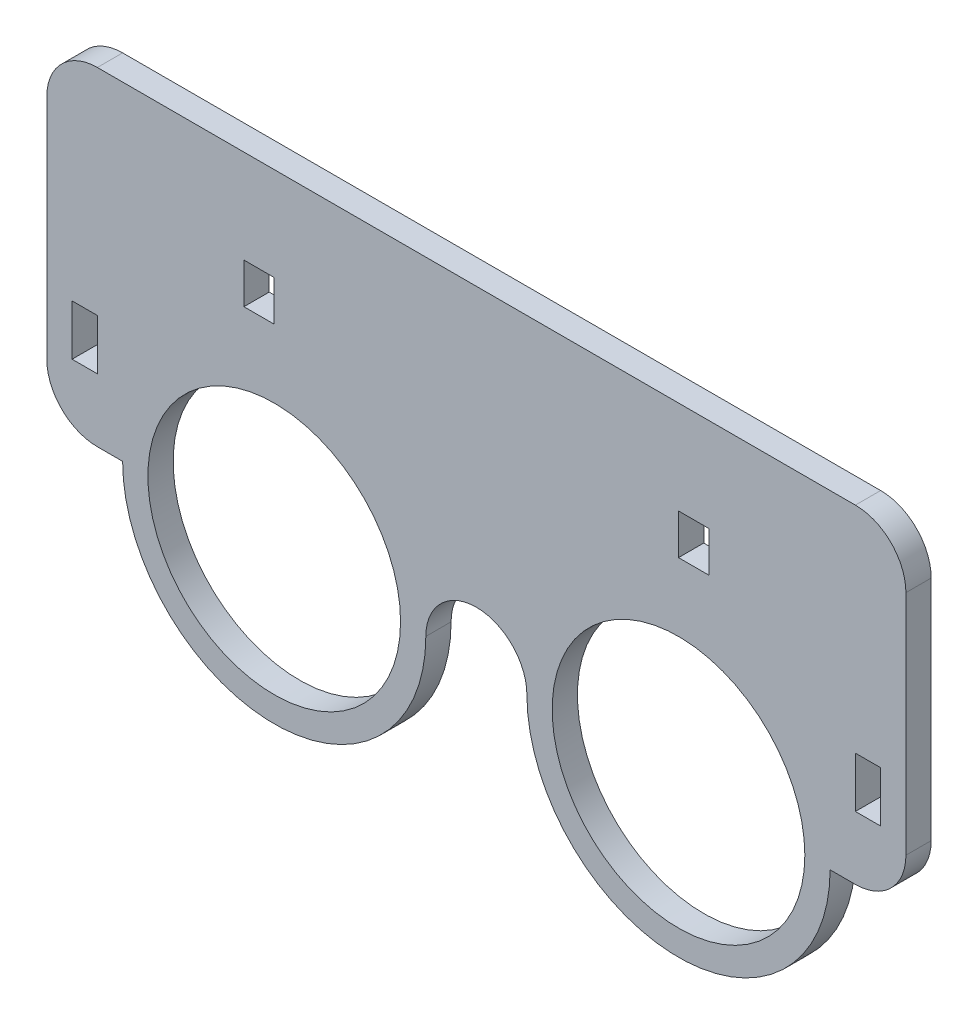
ISO-10303-21;
HEADER;
FILE_DESCRIPTION(('STEP AP214'),'2;1');
FILE_NAME('part.step','',(''),(''),'','','');
FILE_SCHEMA(('AUTOMOTIVE_DESIGN { 1 0 10303 214 1 1 1 1 }'));
ENDSEC;
DATA;
#1=APPLICATION_CONTEXT('core data for automotive mechanical design processes');
#2=APPLICATION_PROTOCOL_DEFINITION('international standard','automotive_design',2000,#1);
#3=PRODUCT_CONTEXT('',#1,'mechanical');
#4=PRODUCT('Part','Part','',(#3));
#5=PRODUCT_RELATED_PRODUCT_CATEGORY('part','',(#4));
#6=PRODUCT_DEFINITION_FORMATION('','',#4);
#7=PRODUCT_DEFINITION_CONTEXT('part definition',#1,'design');
#8=PRODUCT_DEFINITION('design','',#6,#7);
#9=PRODUCT_DEFINITION_SHAPE('','',#8);
#10=(LENGTH_UNIT() NAMED_UNIT(*) SI_UNIT(.MILLI.,.METRE.));
#11=(NAMED_UNIT(*) PLANE_ANGLE_UNIT() SI_UNIT($,.RADIAN.));
#12=(NAMED_UNIT(*) SI_UNIT($,.STERADIAN.) SOLID_ANGLE_UNIT());
#13=UNCERTAINTY_MEASURE_WITH_UNIT(LENGTH_MEASURE(1.E-05),#10,'distance_accuracy_value','');
#14=(GEOMETRIC_REPRESENTATION_CONTEXT(3) GLOBAL_UNCERTAINTY_ASSIGNED_CONTEXT((#13)) GLOBAL_UNIT_ASSIGNED_CONTEXT((#10,
#11,#12)) REPRESENTATION_CONTEXT('',''));
#15=CARTESIAN_POINT('',(0.,0.,0.));
#16=DIRECTION('',(0.,0.,1.));
#17=DIRECTION('',(1.,0.,0.));
#18=AXIS2_PLACEMENT_3D('',#15,#16,#17);
#19=CARTESIAN_POINT('',(0.,0.,5.));
#20=DIRECTION('',(0.,0.,1.));
#21=DIRECTION('',(1.,0.,0.));
#22=AXIS2_PLACEMENT_3D('',#19,#20,#21);
#23=PLANE('',#22);
#24=CARTESIAN_POINT('',(-40.,0.,5.));
#25=DIRECTION('',(0.,0.,1.));
#26=DIRECTION('',(1.,0.,0.));
#27=AXIS2_PLACEMENT_3D('',#24,#25,#26);
#28=CIRCLE('',#27,25.);
#29=CARTESIAN_POINT('',(-15.,0.,5.));
#30=VERTEX_POINT('',#29);
#31=EDGE_CURVE('E326',#30,#30,#28,.T.);
#32=ORIENTED_EDGE('',*,*,#31,.F.);
#33=EDGE_LOOP('',(#32));
#34=FACE_BOUND('',#33,.T.);
#35=CARTESIAN_POINT('',(0.,0.,5.));
#36=DIRECTION('',(0.,0.,-1.));
#37=DIRECTION('',(1.,0.,0.));
#38=AXIS2_PLACEMENT_3D('',#35,#36,#37);
#39=CIRCLE('',#38,10.);
#40=CARTESIAN_POINT('',(-9.99999999999999,0.,5.));
#41=VERTEX_POINT('',#40);
#42=CARTESIAN_POINT('',(9.99999999999999,0.,5.));
#43=VERTEX_POINT('',#42);
#44=EDGE_CURVE('E363',#41,#43,#39,.T.);
#45=ORIENTED_EDGE('',*,*,#44,.T.);
#46=CARTESIAN_POINT('',(40.,0.,5.));
#47=DIRECTION('',(0.,0.,1.));
#48=DIRECTION('',(1.,0.,0.));
#49=AXIS2_PLACEMENT_3D('',#46,#47,#48);
#50=CIRCLE('',#49,30.);
#51=CARTESIAN_POINT('',(70.,0.,5.));
#52=VERTEX_POINT('',#51);
#53=EDGE_CURVE('E366',#43,#52,#50,.T.);
#54=ORIENTED_EDGE('',*,*,#53,.T.);
#55=DIRECTION('',(1.,0.,0.));
#56=VECTOR('',#55,1.);
#57=CARTESIAN_POINT('',(74.9999999999999,0.,5.));
#58=LINE('',#57,#56);
#59=CARTESIAN_POINT('',(74.9999999999999,0.,5.));
#60=VERTEX_POINT('',#59);
#61=EDGE_CURVE('E369',#52,#60,#58,.T.);
#62=ORIENTED_EDGE('',*,*,#61,.T.);
#63=CARTESIAN_POINT('',(75.,10.,5.));
#64=DIRECTION('',(0.,0.,1.));
#65=DIRECTION('',(-1.,0.,0.));
#66=AXIS2_PLACEMENT_3D('',#63,#64,#65);
#67=CIRCLE('',#66,10.);
#68=CARTESIAN_POINT('',(85.,10.0000000000001,5.));
#69=VERTEX_POINT('',#68);
#70=EDGE_CURVE('E371',#60,#69,#67,.T.);
#71=ORIENTED_EDGE('',*,*,#70,.T.);
#72=DIRECTION('',(0.,1.,0.));
#73=VECTOR('',#72,1.);
#74=CARTESIAN_POINT('',(85.,54.9999999999999,5.));
#75=LINE('',#74,#73);
#76=CARTESIAN_POINT('',(85.,54.9999999999999,5.));
#77=VERTEX_POINT('',#76);
#78=EDGE_CURVE('E373',#69,#77,#75,.T.);
#79=ORIENTED_EDGE('',*,*,#78,.T.);
#80=CARTESIAN_POINT('',(75.,55.,5.));
#81=DIRECTION('',(0.,0.,1.));
#82=DIRECTION('',(-1.,0.,0.));
#83=AXIS2_PLACEMENT_3D('',#80,#81,#82);
#84=CIRCLE('',#83,10.);
#85=CARTESIAN_POINT('',(74.9999999999999,65.,5.));
#86=VERTEX_POINT('',#85);
#87=EDGE_CURVE('E375',#77,#86,#84,.T.);
#88=ORIENTED_EDGE('',*,*,#87,.T.);
#89=DIRECTION('',(-1.,0.,0.));
#90=VECTOR('',#89,1.);
#91=CARTESIAN_POINT('',(-74.9999999999999,65.,5.));
#92=LINE('',#91,#90);
#93=CARTESIAN_POINT('',(-74.9999999999999,65.,5.));
#94=VERTEX_POINT('',#93);
#95=EDGE_CURVE('E377',#86,#94,#92,.T.);
#96=ORIENTED_EDGE('',*,*,#95,.T.);
#97=CARTESIAN_POINT('',(-75.,55.,5.));
#98=DIRECTION('',(0.,0.,1.));
#99=DIRECTION('',(-1.,0.,0.));
#100=AXIS2_PLACEMENT_3D('',#97,#98,#99);
#101=CIRCLE('',#100,9.99999999999999);
#102=CARTESIAN_POINT('',(-85.,54.9999999999999,5.));
#103=VERTEX_POINT('',#102);
#104=EDGE_CURVE('E379',#94,#103,#101,.T.);
#105=ORIENTED_EDGE('',*,*,#104,.T.);
#106=DIRECTION('',(0.,-1.,0.));
#107=VECTOR('',#106,1.);
#108=CARTESIAN_POINT('',(-85.,10.0000000000001,5.));
#109=LINE('',#108,#107);
#110=CARTESIAN_POINT('',(-85.,10.0000000000001,5.));
#111=VERTEX_POINT('',#110);
#112=EDGE_CURVE('E381',#103,#111,#109,.T.);
#113=ORIENTED_EDGE('',*,*,#112,.T.);
#114=CARTESIAN_POINT('',(-75.,10.,5.));
#115=DIRECTION('',(0.,0.,1.));
#116=DIRECTION('',(1.,0.,0.));
#117=AXIS2_PLACEMENT_3D('',#114,#115,#116);
#118=CIRCLE('',#117,10.);
#119=CARTESIAN_POINT('',(-74.9999999999999,0.,5.));
#120=VERTEX_POINT('',#119);
#121=EDGE_CURVE('E383',#111,#120,#118,.T.);
#122=ORIENTED_EDGE('',*,*,#121,.T.);
#123=DIRECTION('',(1.,0.,0.));
#124=VECTOR('',#123,1.);
#125=CARTESIAN_POINT('',(-70.,0.,5.));
#126=LINE('',#125,#124);
#127=CARTESIAN_POINT('',(-70.,0.,5.));
#128=VERTEX_POINT('',#127);
#129=EDGE_CURVE('E385',#120,#128,#126,.T.);
#130=ORIENTED_EDGE('',*,*,#129,.T.);
#131=CARTESIAN_POINT('',(-40.,0.,5.));
#132=DIRECTION('',(0.,0.,1.));
#133=DIRECTION('',(1.,0.,0.));
#134=AXIS2_PLACEMENT_3D('',#131,#132,#133);
#135=CIRCLE('',#134,30.);
#136=EDGE_CURVE('E387',#128,#41,#135,.T.);
#137=ORIENTED_EDGE('',*,*,#136,.T.);
#138=EDGE_LOOP('',(#45,#54,#62,#71,#79,#88,#96,#105,#113,#122,#130,#137));
#139=FACE_BOUND('',#138,.T.);
#140=DIRECTION('',(1.,0.,0.));
#141=VECTOR('',#140,1.);
#142=CARTESIAN_POINT('',(-46.,38.5,5.));
#143=LINE('',#142,#141);
#144=CARTESIAN_POINT('',(-46.,38.5,5.));
#145=VERTEX_POINT('',#144);
#146=CARTESIAN_POINT('',(-40.,38.5,5.));
#147=VERTEX_POINT('',#146);
#148=EDGE_CURVE('E334',#145,#147,#143,.T.);
#149=ORIENTED_EDGE('',*,*,#148,.F.);
#150=DIRECTION('',(0.,-1.,0.));
#151=VECTOR('',#150,1.);
#152=CARTESIAN_POINT('',(-46.,38.5,5.));
#153=LINE('',#152,#151);
#154=CARTESIAN_POINT('',(-46.,46.5,5.));
#155=VERTEX_POINT('',#154);
#156=EDGE_CURVE('E332',#155,#145,#153,.T.);
#157=ORIENTED_EDGE('',*,*,#156,.F.);
#158=DIRECTION('',(-1.,0.,0.));
#159=VECTOR('',#158,1.);
#160=CARTESIAN_POINT('',(-46.,46.5,5.));
#161=LINE('',#160,#159);
#162=CARTESIAN_POINT('',(-40.,46.5,5.));
#163=VERTEX_POINT('',#162);
#164=EDGE_CURVE('E340',#163,#155,#161,.T.);
#165=ORIENTED_EDGE('',*,*,#164,.F.);
#166=DIRECTION('',(0.,1.,0.));
#167=VECTOR('',#166,1.);
#168=CARTESIAN_POINT('',(-40.,38.5,5.));
#169=LINE('',#168,#167);
#170=EDGE_CURVE('E337',#147,#163,#169,.T.);
#171=ORIENTED_EDGE('',*,*,#170,.F.);
#172=EDGE_LOOP('',(#149,#157,#165,#171));
#173=FACE_BOUND('',#172,.T.);
#174=CARTESIAN_POINT('',(40.,0.,5.));
#175=DIRECTION('',(0.,0.,1.));
#176=DIRECTION('',(1.,0.,0.));
#177=AXIS2_PLACEMENT_3D('',#174,#175,#176);
#178=CIRCLE('',#177,25.);
#179=CARTESIAN_POINT('',(65.,0.,5.));
#180=VERTEX_POINT('',#179);
#181=EDGE_CURVE('E320',#180,#180,#178,.T.);
#182=ORIENTED_EDGE('',*,*,#181,.F.);
#183=EDGE_LOOP('',(#182));
#184=FACE_BOUND('',#183,.T.);
#185=DIRECTION('',(-1.,0.,0.));
#186=VECTOR('',#185,1.);
#187=CARTESIAN_POINT('',(46.,46.5,5.));
#188=LINE('',#187,#186);
#189=CARTESIAN_POINT('',(46.,46.5,5.));
#190=VERTEX_POINT('',#189);
#191=CARTESIAN_POINT('',(40.,46.5,5.));
#192=VERTEX_POINT('',#191);
#193=EDGE_CURVE('E291',#190,#192,#188,.T.);
#194=ORIENTED_EDGE('',*,*,#193,.F.);
#195=DIRECTION('',(0.,1.,0.));
#196=VECTOR('',#195,1.);
#197=CARTESIAN_POINT('',(46.,38.5,5.));
#198=LINE('',#197,#196);
#199=CARTESIAN_POINT('',(46.,38.5,5.));
#200=VERTEX_POINT('',#199);
#201=EDGE_CURVE('E289',#200,#190,#198,.T.);
#202=ORIENTED_EDGE('',*,*,#201,.F.);
#203=DIRECTION('',(1.,0.,0.));
#204=VECTOR('',#203,1.);
#205=CARTESIAN_POINT('',(46.,38.5,5.));
#206=LINE('',#205,#204);
#207=CARTESIAN_POINT('',(40.,38.5,5.));
#208=VERTEX_POINT('',#207);
#209=EDGE_CURVE('E297',#208,#200,#206,.T.);
#210=ORIENTED_EDGE('',*,*,#209,.F.);
#211=DIRECTION('',(0.,-1.,0.));
#212=VECTOR('',#211,1.);
#213=CARTESIAN_POINT('',(40.,38.5,5.));
#214=LINE('',#213,#212);
#215=EDGE_CURVE('E294',#192,#208,#214,.T.);
#216=ORIENTED_EDGE('',*,*,#215,.F.);
#217=EDGE_LOOP('',(#194,#202,#210,#216));
#218=FACE_BOUND('',#217,.T.);
#219=DIRECTION('',(1.,0.,0.));
#220=VECTOR('',#219,1.);
#221=CARTESIAN_POINT('',(-80.,12.5,5.));
#222=LINE('',#221,#220);
#223=CARTESIAN_POINT('',(-80.,12.5,5.));
#224=VERTEX_POINT('',#223);
#225=CARTESIAN_POINT('',(-75.,12.5,5.));
#226=VERTEX_POINT('',#225);
#227=EDGE_CURVE('E260',#224,#226,#222,.T.);
#228=ORIENTED_EDGE('',*,*,#227,.F.);
#229=DIRECTION('',(0.,-1.,0.));
#230=VECTOR('',#229,1.);
#231=CARTESIAN_POINT('',(-80.,22.5,5.));
#232=LINE('',#231,#230);
#233=CARTESIAN_POINT('',(-80.,22.5,5.));
#234=VERTEX_POINT('',#233);
#235=EDGE_CURVE('E258',#234,#224,#232,.T.);
#236=ORIENTED_EDGE('',*,*,#235,.F.);
#237=DIRECTION('',(-1.,0.,0.));
#238=VECTOR('',#237,1.);
#239=CARTESIAN_POINT('',(-80.,22.5,5.));
#240=LINE('',#239,#238);
#241=CARTESIAN_POINT('',(-75.,22.5,5.));
#242=VERTEX_POINT('',#241);
#243=EDGE_CURVE('E266',#242,#234,#240,.T.);
#244=ORIENTED_EDGE('',*,*,#243,.F.);
#245=DIRECTION('',(0.,1.,0.));
#246=VECTOR('',#245,1.);
#247=CARTESIAN_POINT('',(-75.,22.5,5.));
#248=LINE('',#247,#246);
#249=EDGE_CURVE('E263',#226,#242,#248,.T.);
#250=ORIENTED_EDGE('',*,*,#249,.F.);
#251=EDGE_LOOP('',(#228,#236,#244,#250));
#252=FACE_BOUND('',#251,.T.);
#253=DIRECTION('',(1.,0.,0.));
#254=VECTOR('',#253,1.);
#255=CARTESIAN_POINT('',(75.,12.5,5.));
#256=LINE('',#255,#254);
#257=CARTESIAN_POINT('',(75.,12.5,5.));
#258=VERTEX_POINT('',#257);
#259=CARTESIAN_POINT('',(80.,12.5,5.));
#260=VERTEX_POINT('',#259);
#261=EDGE_CURVE('E230',#258,#260,#256,.T.);
#262=ORIENTED_EDGE('',*,*,#261,.F.);
#263=DIRECTION('',(0.,-1.,0.));
#264=VECTOR('',#263,1.);
#265=CARTESIAN_POINT('',(75.,12.5,5.));
#266=LINE('',#265,#264);
#267=CARTESIAN_POINT('',(75.,22.5,5.));
#268=VERTEX_POINT('',#267);
#269=EDGE_CURVE('E222',#268,#258,#266,.T.);
#270=ORIENTED_EDGE('',*,*,#269,.F.);
#271=DIRECTION('',(-1.,0.,0.));
#272=VECTOR('',#271,1.);
#273=CARTESIAN_POINT('',(75.,22.5,5.));
#274=LINE('',#273,#272);
#275=CARTESIAN_POINT('',(80.,22.5,5.));
#276=VERTEX_POINT('',#275);
#277=EDGE_CURVE('E244',#276,#268,#274,.T.);
#278=ORIENTED_EDGE('',*,*,#277,.F.);
#279=DIRECTION('',(0.,1.,0.));
#280=VECTOR('',#279,1.);
#281=CARTESIAN_POINT('',(80.,12.5,5.));
#282=LINE('',#281,#280);
#283=EDGE_CURVE('E242',#260,#276,#282,.T.);
#284=ORIENTED_EDGE('',*,*,#283,.F.);
#285=EDGE_LOOP('',(#262,#270,#278,#284));
#286=FACE_BOUND('',#285,.T.);
#287=ADVANCED_FACE('F37',(#34,#139,#173,#184,#218,#252,#286),#23,.T.);
#288=CARTESIAN_POINT('',(0.,0.,0.));
#289=DIRECTION('',(0.,0.,1.));
#290=DIRECTION('',(1.,0.,0.));
#291=AXIS2_PLACEMENT_3D('',#288,#289,#290);
#292=PLANE('',#291);
#293=DIRECTION('',(0.,-1.,0.));
#294=VECTOR('',#293,1.);
#295=CARTESIAN_POINT('',(-80.,22.5,0.));
#296=LINE('',#295,#294);
#297=CARTESIAN_POINT('',(-80.,22.5,0.));
#298=VERTEX_POINT('',#297);
#299=CARTESIAN_POINT('',(-80.,12.5,0.));
#300=VERTEX_POINT('',#299);
#301=EDGE_CURVE('E238',#298,#300,#296,.T.);
#302=ORIENTED_EDGE('',*,*,#301,.T.);
#303=DIRECTION('',(1.,0.,0.));
#304=VECTOR('',#303,1.);
#305=CARTESIAN_POINT('',(-80.,12.5,0.));
#306=LINE('',#305,#304);
#307=CARTESIAN_POINT('',(-75.,12.5,0.));
#308=VERTEX_POINT('',#307);
#309=EDGE_CURVE('E271',#300,#308,#306,.T.);
#310=ORIENTED_EDGE('',*,*,#309,.T.);
#311=DIRECTION('',(0.,1.,0.));
#312=VECTOR('',#311,1.);
#313=CARTESIAN_POINT('',(-75.,22.5,0.));
#314=LINE('',#313,#312);
#315=CARTESIAN_POINT('',(-75.,22.5,0.));
#316=VERTEX_POINT('',#315);
#317=EDGE_CURVE('E274',#308,#316,#314,.T.);
#318=ORIENTED_EDGE('',*,*,#317,.T.);
#319=DIRECTION('',(-1.,0.,0.));
#320=VECTOR('',#319,1.);
#321=CARTESIAN_POINT('',(-80.,22.5,0.));
#322=LINE('',#321,#320);
#323=EDGE_CURVE('E261',#316,#298,#322,.T.);
#324=ORIENTED_EDGE('',*,*,#323,.T.);
#325=EDGE_LOOP('',(#302,#310,#318,#324));
#326=FACE_BOUND('',#325,.T.);
#327=CARTESIAN_POINT('',(40.,0.,0.));
#328=DIRECTION('',(0.,0.,1.));
#329=DIRECTION('',(1.,0.,0.));
#330=AXIS2_PLACEMENT_3D('',#327,#328,#329);
#331=CIRCLE('',#330,25.);
#332=CARTESIAN_POINT('',(65.,0.,0.));
#333=VERTEX_POINT('',#332);
#334=EDGE_CURVE('E319',#333,#333,#331,.T.);
#335=ORIENTED_EDGE('',*,*,#334,.T.);
#336=EDGE_LOOP('',(#335));
#337=FACE_BOUND('',#336,.T.);
#338=CARTESIAN_POINT('',(-40.,0.,0.));
#339=DIRECTION('',(0.,0.,1.));
#340=DIRECTION('',(1.,0.,0.));
#341=AXIS2_PLACEMENT_3D('',#338,#339,#340);
#342=CIRCLE('',#341,25.);
#343=CARTESIAN_POINT('',(-15.,0.,0.));
#344=VERTEX_POINT('',#343);
#345=EDGE_CURVE('E323',#344,#344,#342,.T.);
#346=ORIENTED_EDGE('',*,*,#345,.T.);
#347=EDGE_LOOP('',(#346));
#348=FACE_BOUND('',#347,.T.);
#349=DIRECTION('',(0.,-1.,0.));
#350=VECTOR('',#349,1.);
#351=CARTESIAN_POINT('',(-46.,38.5,0.));
#352=LINE('',#351,#350);
#353=CARTESIAN_POINT('',(-46.,46.5,0.));
#354=VERTEX_POINT('',#353);
#355=CARTESIAN_POINT('',(-46.,38.5,0.));
#356=VERTEX_POINT('',#355);
#357=EDGE_CURVE('E329',#354,#356,#352,.T.);
#358=ORIENTED_EDGE('',*,*,#357,.T.);
#359=DIRECTION('',(1.,0.,0.));
#360=VECTOR('',#359,1.);
#361=CARTESIAN_POINT('',(-46.,38.5,0.));
#362=LINE('',#361,#360);
#363=CARTESIAN_POINT('',(-40.,38.5,0.));
#364=VERTEX_POINT('',#363);
#365=EDGE_CURVE('E345',#356,#364,#362,.T.);
#366=ORIENTED_EDGE('',*,*,#365,.T.);
#367=DIRECTION('',(0.,1.,0.));
#368=VECTOR('',#367,1.);
#369=CARTESIAN_POINT('',(-40.,38.5,0.));
#370=LINE('',#369,#368);
#371=CARTESIAN_POINT('',(-40.,46.5,0.));
#372=VERTEX_POINT('',#371);
#373=EDGE_CURVE('E348',#364,#372,#370,.T.);
#374=ORIENTED_EDGE('',*,*,#373,.T.);
#375=DIRECTION('',(-1.,0.,0.));
#376=VECTOR('',#375,1.);
#377=CARTESIAN_POINT('',(-46.,46.5,0.));
#378=LINE('',#377,#376);
#379=EDGE_CURVE('E335',#372,#354,#378,.T.);
#380=ORIENTED_EDGE('',*,*,#379,.T.);
#381=EDGE_LOOP('',(#358,#366,#374,#380));
#382=FACE_BOUND('',#381,.T.);
#383=CARTESIAN_POINT('',(0.,0.,0.));
#384=DIRECTION('',(0.,0.,-1.));
#385=DIRECTION('',(1.,0.,0.));
#386=AXIS2_PLACEMENT_3D('',#383,#384,#385);
#387=CIRCLE('',#386,10.);
#388=CARTESIAN_POINT('',(-9.99999999999999,0.,0.));
#389=VERTEX_POINT('',#388);
#390=CARTESIAN_POINT('',(9.99999999999999,0.,0.));
#391=VERTEX_POINT('',#390);
#392=EDGE_CURVE('E362',#389,#391,#387,.T.);
#393=ORIENTED_EDGE('',*,*,#392,.F.);
#394=CARTESIAN_POINT('',(-40.,0.,0.));
#395=DIRECTION('',(0.,0.,1.));
#396=DIRECTION('',(1.,0.,0.));
#397=AXIS2_PLACEMENT_3D('',#394,#395,#396);
#398=CIRCLE('',#397,30.);
#399=CARTESIAN_POINT('',(-70.,0.,0.));
#400=VERTEX_POINT('',#399);
#401=EDGE_CURVE('E367',#400,#389,#398,.T.);
#402=ORIENTED_EDGE('',*,*,#401,.F.);
#403=DIRECTION('',(1.,0.,0.));
#404=VECTOR('',#403,1.);
#405=CARTESIAN_POINT('',(-70.,0.,0.));
#406=LINE('',#405,#404);
#407=CARTESIAN_POINT('',(-74.9999999999999,0.,0.));
#408=VERTEX_POINT('',#407);
#409=EDGE_CURVE('E410',#408,#400,#406,.T.);
#410=ORIENTED_EDGE('',*,*,#409,.F.);
#411=CARTESIAN_POINT('',(-75.,10.,0.));
#412=DIRECTION('',(0.,0.,1.));
#413=DIRECTION('',(1.,0.,0.));
#414=AXIS2_PLACEMENT_3D('',#411,#412,#413);
#415=CIRCLE('',#414,10.);
#416=CARTESIAN_POINT('',(-85.,10.0000000000001,0.));
#417=VERTEX_POINT('',#416);
#418=EDGE_CURVE('E408',#417,#408,#415,.T.);
#419=ORIENTED_EDGE('',*,*,#418,.F.);
#420=DIRECTION('',(0.,-1.,0.));
#421=VECTOR('',#420,1.);
#422=CARTESIAN_POINT('',(-85.,10.0000000000001,0.));
#423=LINE('',#422,#421);
#424=CARTESIAN_POINT('',(-85.,54.9999999999999,0.));
#425=VERTEX_POINT('',#424);
#426=EDGE_CURVE('E406',#425,#417,#423,.T.);
#427=ORIENTED_EDGE('',*,*,#426,.F.);
#428=CARTESIAN_POINT('',(-75.,55.,0.));
#429=DIRECTION('',(0.,0.,1.));
#430=DIRECTION('',(-1.,0.,0.));
#431=AXIS2_PLACEMENT_3D('',#428,#429,#430);
#432=CIRCLE('',#431,9.99999999999999);
#433=CARTESIAN_POINT('',(-74.9999999999999,65.,0.));
#434=VERTEX_POINT('',#433);
#435=EDGE_CURVE('E404',#434,#425,#432,.T.);
#436=ORIENTED_EDGE('',*,*,#435,.F.);
#437=DIRECTION('',(-1.,0.,0.));
#438=VECTOR('',#437,1.);
#439=CARTESIAN_POINT('',(-74.9999999999999,65.,0.));
#440=LINE('',#439,#438);
#441=CARTESIAN_POINT('',(74.9999999999999,65.,0.));
#442=VERTEX_POINT('',#441);
#443=EDGE_CURVE('E402',#442,#434,#440,.T.);
#444=ORIENTED_EDGE('',*,*,#443,.F.);
#445=CARTESIAN_POINT('',(75.,55.,0.));
#446=DIRECTION('',(0.,0.,1.));
#447=DIRECTION('',(-1.,0.,0.));
#448=AXIS2_PLACEMENT_3D('',#445,#446,#447);
#449=CIRCLE('',#448,10.);
#450=CARTESIAN_POINT('',(85.,54.9999999999999,0.));
#451=VERTEX_POINT('',#450);
#452=EDGE_CURVE('E400',#451,#442,#449,.T.);
#453=ORIENTED_EDGE('',*,*,#452,.F.);
#454=DIRECTION('',(0.,1.,0.));
#455=VECTOR('',#454,1.);
#456=CARTESIAN_POINT('',(85.,54.9999999999999,0.));
#457=LINE('',#456,#455);
#458=CARTESIAN_POINT('',(85.,10.0000000000001,0.));
#459=VERTEX_POINT('',#458);
#460=EDGE_CURVE('E398',#459,#451,#457,.T.);
#461=ORIENTED_EDGE('',*,*,#460,.F.);
#462=CARTESIAN_POINT('',(75.,10.,0.));
#463=DIRECTION('',(0.,0.,1.));
#464=DIRECTION('',(-1.,0.,0.));
#465=AXIS2_PLACEMENT_3D('',#462,#463,#464);
#466=CIRCLE('',#465,10.);
#467=CARTESIAN_POINT('',(74.9999999999999,0.,0.));
#468=VERTEX_POINT('',#467);
#469=EDGE_CURVE('E396',#468,#459,#466,.T.);
#470=ORIENTED_EDGE('',*,*,#469,.F.);
#471=DIRECTION('',(1.,0.,0.));
#472=VECTOR('',#471,1.);
#473=CARTESIAN_POINT('',(74.9999999999999,0.,0.));
#474=LINE('',#473,#472);
#475=CARTESIAN_POINT('',(70.,0.,0.));
#476=VERTEX_POINT('',#475);
#477=EDGE_CURVE('E394',#476,#468,#474,.T.);
#478=ORIENTED_EDGE('',*,*,#477,.F.);
#479=CARTESIAN_POINT('',(40.,0.,0.));
#480=DIRECTION('',(0.,0.,1.));
#481=DIRECTION('',(1.,0.,0.));
#482=AXIS2_PLACEMENT_3D('',#479,#480,#481);
#483=CIRCLE('',#482,30.);
#484=EDGE_CURVE('E392',#391,#476,#483,.T.);
#485=ORIENTED_EDGE('',*,*,#484,.F.);
#486=EDGE_LOOP('',(#393,#402,#410,#419,#427,#436,#444,#453,#461,#470,#478,#485));
#487=FACE_BOUND('',#486,.T.);
#488=DIRECTION('',(0.,1.,0.));
#489=VECTOR('',#488,1.);
#490=CARTESIAN_POINT('',(46.,38.5,0.));
#491=LINE('',#490,#489);
#492=CARTESIAN_POINT('',(46.,38.5,0.));
#493=VERTEX_POINT('',#492);
#494=CARTESIAN_POINT('',(46.,46.5,0.));
#495=VERTEX_POINT('',#494);
#496=EDGE_CURVE('E288',#493,#495,#491,.T.);
#497=ORIENTED_EDGE('',*,*,#496,.T.);
#498=DIRECTION('',(-1.,0.,0.));
#499=VECTOR('',#498,1.);
#500=CARTESIAN_POINT('',(46.,46.5,0.));
#501=LINE('',#500,#499);
#502=CARTESIAN_POINT('',(40.,46.5,0.));
#503=VERTEX_POINT('',#502);
#504=EDGE_CURVE('E302',#495,#503,#501,.T.);
#505=ORIENTED_EDGE('',*,*,#504,.T.);
#506=DIRECTION('',(0.,-1.,0.));
#507=VECTOR('',#506,1.);
#508=CARTESIAN_POINT('',(40.,38.5,0.));
#509=LINE('',#508,#507);
#510=CARTESIAN_POINT('',(40.,38.5,0.));
#511=VERTEX_POINT('',#510);
#512=EDGE_CURVE('E305',#503,#511,#509,.T.);
#513=ORIENTED_EDGE('',*,*,#512,.T.);
#514=DIRECTION('',(1.,0.,0.));
#515=VECTOR('',#514,1.);
#516=CARTESIAN_POINT('',(46.,38.5,0.));
#517=LINE('',#516,#515);
#518=EDGE_CURVE('E292',#511,#493,#517,.T.);
#519=ORIENTED_EDGE('',*,*,#518,.T.);
#520=EDGE_LOOP('',(#497,#505,#513,#519));
#521=FACE_BOUND('',#520,.T.);
#522=DIRECTION('',(0.,-1.,0.));
#523=VECTOR('',#522,1.);
#524=CARTESIAN_POINT('',(75.,12.5,0.));
#525=LINE('',#524,#523);
#526=CARTESIAN_POINT('',(75.,22.5,0.));
#527=VERTEX_POINT('',#526);
#528=CARTESIAN_POINT('',(75.,12.5,0.));
#529=VERTEX_POINT('',#528);
#530=EDGE_CURVE('E60',#527,#529,#525,.T.);
#531=ORIENTED_EDGE('',*,*,#530,.T.);
#532=DIRECTION('',(1.,0.,0.));
#533=VECTOR('',#532,1.);
#534=CARTESIAN_POINT('',(75.,12.5,0.));
#535=LINE('',#534,#533);
#536=CARTESIAN_POINT('',(80.,12.5,0.));
#537=VERTEX_POINT('',#536);
#538=EDGE_CURVE('E237',#529,#537,#535,.T.);
#539=ORIENTED_EDGE('',*,*,#538,.T.);
#540=DIRECTION('',(0.,1.,0.));
#541=VECTOR('',#540,1.);
#542=CARTESIAN_POINT('',(80.,12.5,0.));
#543=LINE('',#542,#541);
#544=CARTESIAN_POINT('',(80.,22.5,0.));
#545=VERTEX_POINT('',#544);
#546=EDGE_CURVE('E250',#537,#545,#543,.T.);
#547=ORIENTED_EDGE('',*,*,#546,.T.);
#548=DIRECTION('',(-1.,0.,0.));
#549=VECTOR('',#548,1.);
#550=CARTESIAN_POINT('',(75.,22.5,0.));
#551=LINE('',#550,#549);
#552=EDGE_CURVE('E231',#545,#527,#551,.T.);
#553=ORIENTED_EDGE('',*,*,#552,.T.);
#554=EDGE_LOOP('',(#531,#539,#547,#553));
#555=FACE_BOUND('',#554,.T.);
#556=ADVANCED_FACE('F452',(#326,#337,#348,#382,#487,#521,#555),#292,.F.);
#557=CARTESIAN_POINT('',(0.,0.,5.));
#558=DIRECTION('',(0.,0.,-1.));
#559=DIRECTION('',(-1.,0.,0.));
#560=AXIS2_PLACEMENT_3D('',#557,#558,#559);
#561=CYLINDRICAL_SURFACE('',#560,10.);
#562=ORIENTED_EDGE('',*,*,#392,.T.);
#563=DIRECTION('',(0.,0.,-1.));
#564=VECTOR('',#563,1.);
#565=CARTESIAN_POINT('',(9.99999999999999,0.,5.));
#566=LINE('',#565,#564);
#567=EDGE_CURVE('E11',#43,#391,#566,.T.);
#568=ORIENTED_EDGE('',*,*,#567,.F.);
#569=ORIENTED_EDGE('',*,*,#44,.F.);
#570=DIRECTION('',(0.,0.,-1.));
#571=VECTOR('',#570,1.);
#572=CARTESIAN_POINT('',(-9.99999999999999,0.,5.));
#573=LINE('',#572,#571);
#574=EDGE_CURVE('E389',#41,#389,#573,.T.);
#575=ORIENTED_EDGE('',*,*,#574,.T.);
#576=EDGE_LOOP('',(#562,#568,#569,#575));
#577=FACE_BOUND('',#576,.T.);
#578=ADVANCED_FACE('F39',(#577),#561,.F.);
#579=CARTESIAN_POINT('',(40.,0.,5.));
#580=DIRECTION('',(0.,0.,-1.));
#581=DIRECTION('',(-1.,0.,0.));
#582=AXIS2_PLACEMENT_3D('',#579,#580,#581);
#583=CYLINDRICAL_SURFACE('',#582,30.);
#584=ORIENTED_EDGE('',*,*,#484,.T.);
#585=DIRECTION('',(0.,0.,-1.));
#586=VECTOR('',#585,1.);
#587=CARTESIAN_POINT('',(70.,0.,5.));
#588=LINE('',#587,#586);
#589=EDGE_CURVE('E45',#52,#476,#588,.T.);
#590=ORIENTED_EDGE('',*,*,#589,.F.);
#591=ORIENTED_EDGE('',*,*,#53,.F.);
#592=ORIENTED_EDGE('',*,*,#567,.T.);
#593=EDGE_LOOP('',(#584,#590,#591,#592));
#594=FACE_BOUND('',#593,.T.);
#595=ADVANCED_FACE('F470',(#594),#583,.T.);
#596=CARTESIAN_POINT('',(74.9999999999999,0.,5.));
#597=DIRECTION('',(0.,1.,0.));
#598=DIRECTION('',(-1.,0.,0.));
#599=AXIS2_PLACEMENT_3D('',#596,#597,#598);
#600=PLANE('',#599);
#601=ORIENTED_EDGE('',*,*,#477,.T.);
#602=DIRECTION('',(0.,0.,-1.));
#603=VECTOR('',#602,1.);
#604=CARTESIAN_POINT('',(74.9999999999999,0.,5.));
#605=LINE('',#604,#603);
#606=EDGE_CURVE('E439',#60,#468,#605,.T.);
#607=ORIENTED_EDGE('',*,*,#606,.F.);
#608=ORIENTED_EDGE('',*,*,#61,.F.);
#609=ORIENTED_EDGE('',*,*,#589,.T.);
#610=EDGE_LOOP('',(#601,#607,#608,#609));
#611=FACE_BOUND('',#610,.T.);
#612=ADVANCED_FACE('F446',(#611),#600,.F.);
#613=CARTESIAN_POINT('',(75.,10.,5.));
#614=DIRECTION('',(0.,0.,-1.));
#615=DIRECTION('',(-1.,0.,0.));
#616=AXIS2_PLACEMENT_3D('',#613,#614,#615);
#617=CYLINDRICAL_SURFACE('',#616,10.);
#618=ORIENTED_EDGE('',*,*,#469,.T.);
#619=DIRECTION('',(0.,0.,-1.));
#620=VECTOR('',#619,1.);
#621=CARTESIAN_POINT('',(85.,10.0000000000001,5.));
#622=LINE('',#621,#620);
#623=EDGE_CURVE('E436',#69,#459,#622,.T.);
#624=ORIENTED_EDGE('',*,*,#623,.F.);
#625=ORIENTED_EDGE('',*,*,#70,.F.);
#626=ORIENTED_EDGE('',*,*,#606,.T.);
#627=EDGE_LOOP('',(#618,#624,#625,#626));
#628=FACE_BOUND('',#627,.T.);
#629=ADVANCED_FACE('F458',(#628),#617,.T.);
#630=CARTESIAN_POINT('',(85.,54.9999999999999,5.));
#631=DIRECTION('',(-1.,0.,0.));
#632=DIRECTION('',(0.,-1.,0.));
#633=AXIS2_PLACEMENT_3D('',#630,#631,#632);
#634=PLANE('',#633);
#635=ORIENTED_EDGE('',*,*,#460,.T.);
#636=DIRECTION('',(0.,0.,-1.));
#637=VECTOR('',#636,1.);
#638=CARTESIAN_POINT('',(85.,54.9999999999999,5.));
#639=LINE('',#638,#637);
#640=EDGE_CURVE('E433',#77,#451,#639,.T.);
#641=ORIENTED_EDGE('',*,*,#640,.F.);
#642=ORIENTED_EDGE('',*,*,#78,.F.);
#643=ORIENTED_EDGE('',*,*,#623,.T.);
#644=EDGE_LOOP('',(#635,#641,#642,#643));
#645=FACE_BOUND('',#644,.T.);
#646=ADVANCED_FACE('F462',(#645),#634,.F.);
#647=CARTESIAN_POINT('',(75.,55.,5.));
#648=DIRECTION('',(0.,0.,-1.));
#649=DIRECTION('',(-1.,0.,0.));
#650=AXIS2_PLACEMENT_3D('',#647,#648,#649);
#651=CYLINDRICAL_SURFACE('',#650,10.);
#652=ORIENTED_EDGE('',*,*,#452,.T.);
#653=DIRECTION('',(0.,0.,-1.));
#654=VECTOR('',#653,1.);
#655=CARTESIAN_POINT('',(74.9999999999999,65.,5.));
#656=LINE('',#655,#654);
#657=EDGE_CURVE('E430',#86,#442,#656,.T.);
#658=ORIENTED_EDGE('',*,*,#657,.F.);
#659=ORIENTED_EDGE('',*,*,#87,.F.);
#660=ORIENTED_EDGE('',*,*,#640,.T.);
#661=EDGE_LOOP('',(#652,#658,#659,#660));
#662=FACE_BOUND('',#661,.T.);
#663=ADVANCED_FACE('F503',(#662),#651,.T.);
#664=CARTESIAN_POINT('',(-74.9999999999999,65.,5.));
#665=DIRECTION('',(0.,-1.,0.));
#666=DIRECTION('',(0.,0.,-1.));
#667=AXIS2_PLACEMENT_3D('',#664,#665,#666);
#668=PLANE('',#667);
#669=ORIENTED_EDGE('',*,*,#443,.T.);
#670=DIRECTION('',(0.,0.,-1.));
#671=VECTOR('',#670,1.);
#672=CARTESIAN_POINT('',(-74.9999999999999,65.,5.));
#673=LINE('',#672,#671);
#674=EDGE_CURVE('E427',#94,#434,#673,.T.);
#675=ORIENTED_EDGE('',*,*,#674,.F.);
#676=ORIENTED_EDGE('',*,*,#95,.F.);
#677=ORIENTED_EDGE('',*,*,#657,.T.);
#678=EDGE_LOOP('',(#669,#675,#676,#677));
#679=FACE_BOUND('',#678,.T.);
#680=ADVANCED_FACE('F501',(#679),#668,.F.);
#681=CARTESIAN_POINT('',(-75.,55.,5.));
#682=DIRECTION('',(0.,0.,-1.));
#683=DIRECTION('',(-1.,0.,0.));
#684=AXIS2_PLACEMENT_3D('',#681,#682,#683);
#685=CYLINDRICAL_SURFACE('',#684,9.99999999999999);
#686=ORIENTED_EDGE('',*,*,#435,.T.);
#687=DIRECTION('',(0.,0.,-1.));
#688=VECTOR('',#687,1.);
#689=CARTESIAN_POINT('',(-85.,54.9999999999999,5.));
#690=LINE('',#689,#688);
#691=EDGE_CURVE('E424',#103,#425,#690,.T.);
#692=ORIENTED_EDGE('',*,*,#691,.F.);
#693=ORIENTED_EDGE('',*,*,#104,.F.);
#694=ORIENTED_EDGE('',*,*,#674,.T.);
#695=EDGE_LOOP('',(#686,#692,#693,#694));
#696=FACE_BOUND('',#695,.T.);
#697=ADVANCED_FACE('F497',(#696),#685,.T.);
#698=CARTESIAN_POINT('',(-85.,10.0000000000001,5.));
#699=DIRECTION('',(1.,0.,0.));
#700=DIRECTION('',(0.,0.,-1.));
#701=AXIS2_PLACEMENT_3D('',#698,#699,#700);
#702=PLANE('',#701);
#703=ORIENTED_EDGE('',*,*,#426,.T.);
#704=DIRECTION('',(0.,0.,-1.));
#705=VECTOR('',#704,1.);
#706=CARTESIAN_POINT('',(-85.,10.0000000000001,5.));
#707=LINE('',#706,#705);
#708=EDGE_CURVE('E421',#111,#417,#707,.T.);
#709=ORIENTED_EDGE('',*,*,#708,.F.);
#710=ORIENTED_EDGE('',*,*,#112,.F.);
#711=ORIENTED_EDGE('',*,*,#691,.T.);
#712=EDGE_LOOP('',(#703,#709,#710,#711));
#713=FACE_BOUND('',#712,.T.);
#714=ADVANCED_FACE('F492',(#713),#702,.F.);
#715=CARTESIAN_POINT('',(-75.,10.,5.));
#716=DIRECTION('',(0.,0.,-1.));
#717=DIRECTION('',(-1.,0.,0.));
#718=AXIS2_PLACEMENT_3D('',#715,#716,#717);
#719=CYLINDRICAL_SURFACE('',#718,10.);
#720=ORIENTED_EDGE('',*,*,#418,.T.);
#721=DIRECTION('',(0.,0.,-1.));
#722=VECTOR('',#721,1.);
#723=CARTESIAN_POINT('',(-74.9999999999999,0.,5.));
#724=LINE('',#723,#722);
#725=EDGE_CURVE('E418',#120,#408,#724,.T.);
#726=ORIENTED_EDGE('',*,*,#725,.F.);
#727=ORIENTED_EDGE('',*,*,#121,.F.);
#728=ORIENTED_EDGE('',*,*,#708,.T.);
#729=EDGE_LOOP('',(#720,#726,#727,#728));
#730=FACE_BOUND('',#729,.T.);
#731=ADVANCED_FACE('F486',(#730),#719,.T.);
#732=CARTESIAN_POINT('',(-70.,0.,5.));
#733=DIRECTION('',(0.,1.,0.));
#734=DIRECTION('',(-1.,0.,0.));
#735=AXIS2_PLACEMENT_3D('',#732,#733,#734);
#736=PLANE('',#735);
#737=ORIENTED_EDGE('',*,*,#409,.T.);
#738=DIRECTION('',(0.,0.,-1.));
#739=VECTOR('',#738,1.);
#740=CARTESIAN_POINT('',(-70.,0.,5.));
#741=LINE('',#740,#739);
#742=EDGE_CURVE('E415',#128,#400,#741,.T.);
#743=ORIENTED_EDGE('',*,*,#742,.F.);
#744=ORIENTED_EDGE('',*,*,#129,.F.);
#745=ORIENTED_EDGE('',*,*,#725,.T.);
#746=EDGE_LOOP('',(#737,#743,#744,#745));
#747=FACE_BOUND('',#746,.T.);
#748=ADVANCED_FACE('F482',(#747),#736,.F.);
#749=CARTESIAN_POINT('',(-40.,0.,5.));
#750=DIRECTION('',(0.,0.,-1.));
#751=DIRECTION('',(-1.,0.,0.));
#752=AXIS2_PLACEMENT_3D('',#749,#750,#751);
#753=CYLINDRICAL_SURFACE('',#752,30.);
#754=ORIENTED_EDGE('',*,*,#401,.T.);
#755=ORIENTED_EDGE('',*,*,#574,.F.);
#756=ORIENTED_EDGE('',*,*,#136,.F.);
#757=ORIENTED_EDGE('',*,*,#742,.T.);
#758=EDGE_LOOP('',(#754,#755,#756,#757));
#759=FACE_BOUND('',#758,.T.);
#760=ADVANCED_FACE('F477',(#759),#753,.T.);
#761=CARTESIAN_POINT('',(-46.,38.5,5.));
#762=DIRECTION('',(1.,0.,0.));
#763=DIRECTION('',(0.,0.,-1.));
#764=AXIS2_PLACEMENT_3D('',#761,#762,#763);
#765=PLANE('',#764);
#766=ORIENTED_EDGE('',*,*,#357,.F.);
#767=DIRECTION('',(0.,0.,-1.));
#768=VECTOR('',#767,1.);
#769=CARTESIAN_POINT('',(-46.,46.5,5.));
#770=LINE('',#769,#768);
#771=EDGE_CURVE('E342',#155,#354,#770,.T.);
#772=ORIENTED_EDGE('',*,*,#771,.F.);
#773=ORIENTED_EDGE('',*,*,#156,.T.);
#774=DIRECTION('',(0.,0.,-1.));
#775=VECTOR('',#774,1.);
#776=CARTESIAN_POINT('',(-46.,38.5,5.));
#777=LINE('',#776,#775);
#778=EDGE_CURVE('E359',#145,#356,#777,.T.);
#779=ORIENTED_EDGE('',*,*,#778,.T.);
#780=EDGE_LOOP('',(#766,#772,#773,#779));
#781=FACE_BOUND('',#780,.T.);
#782=ADVANCED_FACE('F522',(#781),#765,.T.);
#783=CARTESIAN_POINT('',(-46.,38.5,5.));
#784=DIRECTION('',(0.,1.,0.));
#785=DIRECTION('',(0.,0.,1.));
#786=AXIS2_PLACEMENT_3D('',#783,#784,#785);
#787=PLANE('',#786);
#788=ORIENTED_EDGE('',*,*,#365,.F.);
#789=ORIENTED_EDGE('',*,*,#778,.F.);
#790=ORIENTED_EDGE('',*,*,#148,.T.);
#791=DIRECTION('',(0.,0.,-1.));
#792=VECTOR('',#791,1.);
#793=CARTESIAN_POINT('',(-40.,38.5,5.));
#794=LINE('',#793,#792);
#795=EDGE_CURVE('E357',#147,#364,#794,.T.);
#796=ORIENTED_EDGE('',*,*,#795,.T.);
#797=EDGE_LOOP('',(#788,#789,#790,#796));
#798=FACE_BOUND('',#797,.T.);
#799=ADVANCED_FACE('F560',(#798),#787,.T.);
#800=CARTESIAN_POINT('',(-40.,38.5,5.));
#801=DIRECTION('',(-1.,0.,0.));
#802=DIRECTION('',(0.,0.,1.));
#803=AXIS2_PLACEMENT_3D('',#800,#801,#802);
#804=PLANE('',#803);
#805=ORIENTED_EDGE('',*,*,#373,.F.);
#806=ORIENTED_EDGE('',*,*,#795,.F.);
#807=ORIENTED_EDGE('',*,*,#170,.T.);
#808=DIRECTION('',(0.,0.,-1.));
#809=VECTOR('',#808,1.);
#810=CARTESIAN_POINT('',(-40.,46.5,5.));
#811=LINE('',#810,#809);
#812=EDGE_CURVE('E355',#163,#372,#811,.T.);
#813=ORIENTED_EDGE('',*,*,#812,.T.);
#814=EDGE_LOOP('',(#805,#806,#807,#813));
#815=FACE_BOUND('',#814,.T.);
#816=ADVANCED_FACE('F567',(#815),#804,.T.);
#817=CARTESIAN_POINT('',(-46.,46.5,5.));
#818=DIRECTION('',(0.,-1.,0.));
#819=DIRECTION('',(0.,0.,-1.));
#820=AXIS2_PLACEMENT_3D('',#817,#818,#819);
#821=PLANE('',#820);
#822=ORIENTED_EDGE('',*,*,#379,.F.);
#823=ORIENTED_EDGE('',*,*,#812,.F.);
#824=ORIENTED_EDGE('',*,*,#164,.T.);
#825=ORIENTED_EDGE('',*,*,#771,.T.);
#826=EDGE_LOOP('',(#822,#823,#824,#825));
#827=FACE_BOUND('',#826,.T.);
#828=ADVANCED_FACE('F574',(#827),#821,.T.);
#829=CARTESIAN_POINT('',(-40.,0.,5.));
#830=DIRECTION('',(0.,0.,-1.));
#831=DIRECTION('',(-1.,0.,0.));
#832=AXIS2_PLACEMENT_3D('',#829,#830,#831);
#833=CYLINDRICAL_SURFACE('',#832,25.);
#834=ORIENTED_EDGE('',*,*,#31,.T.);
#835=EDGE_LOOP('',(#834));
#836=FACE_BOUND('',#835,.T.);
#837=ORIENTED_EDGE('',*,*,#345,.F.);
#838=EDGE_LOOP('',(#837));
#839=FACE_BOUND('',#838,.T.);
#840=ADVANCED_FACE('F582',(#836,#839),#833,.F.);
#841=CARTESIAN_POINT('',(40.,0.,5.));
#842=DIRECTION('',(0.,0.,-1.));
#843=DIRECTION('',(-1.,0.,0.));
#844=AXIS2_PLACEMENT_3D('',#841,#842,#843);
#845=CYLINDRICAL_SURFACE('',#844,25.);
#846=ORIENTED_EDGE('',*,*,#181,.T.);
#847=EDGE_LOOP('',(#846));
#848=FACE_BOUND('',#847,.T.);
#849=ORIENTED_EDGE('',*,*,#334,.F.);
#850=EDGE_LOOP('',(#849));
#851=FACE_BOUND('',#850,.T.);
#852=ADVANCED_FACE('F590',(#848,#851),#845,.F.);
#853=CARTESIAN_POINT('',(46.,38.5,5.));
#854=DIRECTION('',(-1.,0.,0.));
#855=DIRECTION('',(0.,0.,1.));
#856=AXIS2_PLACEMENT_3D('',#853,#854,#855);
#857=PLANE('',#856);
#858=ORIENTED_EDGE('',*,*,#496,.F.);
#859=DIRECTION('',(0.,0.,-1.));
#860=VECTOR('',#859,1.);
#861=CARTESIAN_POINT('',(46.,38.5,5.));
#862=LINE('',#861,#860);
#863=EDGE_CURVE('E299',#200,#493,#862,.T.);
#864=ORIENTED_EDGE('',*,*,#863,.F.);
#865=ORIENTED_EDGE('',*,*,#201,.T.);
#866=DIRECTION('',(0.,0.,-1.));
#867=VECTOR('',#866,1.);
#868=CARTESIAN_POINT('',(46.,46.5,5.));
#869=LINE('',#868,#867);
#870=EDGE_CURVE('E316',#190,#495,#869,.T.);
#871=ORIENTED_EDGE('',*,*,#870,.T.);
#872=EDGE_LOOP('',(#858,#864,#865,#871));
#873=FACE_BOUND('',#872,.T.);
#874=ADVANCED_FACE('F598',(#873),#857,.T.);
#875=CARTESIAN_POINT('',(46.,46.5,5.));
#876=DIRECTION('',(0.,-1.,0.));
#877=DIRECTION('',(0.,0.,-1.));
#878=AXIS2_PLACEMENT_3D('',#875,#876,#877);
#879=PLANE('',#878);
#880=ORIENTED_EDGE('',*,*,#504,.F.);
#881=ORIENTED_EDGE('',*,*,#870,.F.);
#882=ORIENTED_EDGE('',*,*,#193,.T.);
#883=DIRECTION('',(0.,0.,-1.));
#884=VECTOR('',#883,1.);
#885=CARTESIAN_POINT('',(40.,46.5,5.));
#886=LINE('',#885,#884);
#887=EDGE_CURVE('E314',#192,#503,#886,.T.);
#888=ORIENTED_EDGE('',*,*,#887,.T.);
#889=EDGE_LOOP('',(#880,#881,#882,#888));
#890=FACE_BOUND('',#889,.T.);
#891=ADVANCED_FACE('F606',(#890),#879,.T.);
#892=CARTESIAN_POINT('',(40.,38.5,5.));
#893=DIRECTION('',(1.,0.,0.));
#894=DIRECTION('',(0.,0.,-1.));
#895=AXIS2_PLACEMENT_3D('',#892,#893,#894);
#896=PLANE('',#895);
#897=ORIENTED_EDGE('',*,*,#512,.F.);
#898=ORIENTED_EDGE('',*,*,#887,.F.);
#899=ORIENTED_EDGE('',*,*,#215,.T.);
#900=DIRECTION('',(0.,0.,-1.));
#901=VECTOR('',#900,1.);
#902=CARTESIAN_POINT('',(40.,38.5,5.));
#903=LINE('',#902,#901);
#904=EDGE_CURVE('E312',#208,#511,#903,.T.);
#905=ORIENTED_EDGE('',*,*,#904,.T.);
#906=EDGE_LOOP('',(#897,#898,#899,#905));
#907=FACE_BOUND('',#906,.T.);
#908=ADVANCED_FACE('F614',(#907),#896,.T.);
#909=CARTESIAN_POINT('',(46.,38.5,5.));
#910=DIRECTION('',(0.,1.,0.));
#911=DIRECTION('',(0.,0.,1.));
#912=AXIS2_PLACEMENT_3D('',#909,#910,#911);
#913=PLANE('',#912);
#914=ORIENTED_EDGE('',*,*,#518,.F.);
#915=ORIENTED_EDGE('',*,*,#904,.F.);
#916=ORIENTED_EDGE('',*,*,#209,.T.);
#917=ORIENTED_EDGE('',*,*,#863,.T.);
#918=EDGE_LOOP('',(#914,#915,#916,#917));
#919=FACE_BOUND('',#918,.T.);
#920=ADVANCED_FACE('F622',(#919),#913,.T.);
#921=CARTESIAN_POINT('',(-80.,22.5,5.));
#922=DIRECTION('',(1.,0.,0.));
#923=DIRECTION('',(0.,0.,-1.));
#924=AXIS2_PLACEMENT_3D('',#921,#922,#923);
#925=PLANE('',#924);
#926=ORIENTED_EDGE('',*,*,#301,.F.);
#927=DIRECTION('',(0.,0.,-1.));
#928=VECTOR('',#927,1.);
#929=CARTESIAN_POINT('',(-80.,22.5,5.));
#930=LINE('',#929,#928);
#931=EDGE_CURVE('E268',#234,#298,#930,.T.);
#932=ORIENTED_EDGE('',*,*,#931,.F.);
#933=ORIENTED_EDGE('',*,*,#235,.T.);
#934=DIRECTION('',(0.,0.,-1.));
#935=VECTOR('',#934,1.);
#936=CARTESIAN_POINT('',(-80.,12.5,5.));
#937=LINE('',#936,#935);
#938=EDGE_CURVE('E285',#224,#300,#937,.T.);
#939=ORIENTED_EDGE('',*,*,#938,.T.);
#940=EDGE_LOOP('',(#926,#932,#933,#939));
#941=FACE_BOUND('',#940,.T.);
#942=ADVANCED_FACE('F630',(#941),#925,.T.);
#943=CARTESIAN_POINT('',(-80.,12.5,5.));
#944=DIRECTION('',(0.,1.,0.));
#945=DIRECTION('',(-1.,0.,0.));
#946=AXIS2_PLACEMENT_3D('',#943,#944,#945);
#947=PLANE('',#946);
#948=ORIENTED_EDGE('',*,*,#309,.F.);
#949=ORIENTED_EDGE('',*,*,#938,.F.);
#950=ORIENTED_EDGE('',*,*,#227,.T.);
#951=DIRECTION('',(0.,0.,-1.));
#952=VECTOR('',#951,1.);
#953=CARTESIAN_POINT('',(-75.,12.5,5.));
#954=LINE('',#953,#952);
#955=EDGE_CURVE('E283',#226,#308,#954,.T.);
#956=ORIENTED_EDGE('',*,*,#955,.T.);
#957=EDGE_LOOP('',(#948,#949,#950,#956));
#958=FACE_BOUND('',#957,.T.);
#959=ADVANCED_FACE('F638',(#958),#947,.T.);
#960=CARTESIAN_POINT('',(-75.,22.5,5.));
#961=DIRECTION('',(-1.,0.,0.));
#962=DIRECTION('',(0.,0.,1.));
#963=AXIS2_PLACEMENT_3D('',#960,#961,#962);
#964=PLANE('',#963);
#965=ORIENTED_EDGE('',*,*,#317,.F.);
#966=ORIENTED_EDGE('',*,*,#955,.F.);
#967=ORIENTED_EDGE('',*,*,#249,.T.);
#968=DIRECTION('',(0.,0.,-1.));
#969=VECTOR('',#968,1.);
#970=CARTESIAN_POINT('',(-75.,22.5,5.));
#971=LINE('',#970,#969);
#972=EDGE_CURVE('E281',#242,#316,#971,.T.);
#973=ORIENTED_EDGE('',*,*,#972,.T.);
#974=EDGE_LOOP('',(#965,#966,#967,#973));
#975=FACE_BOUND('',#974,.T.);
#976=ADVANCED_FACE('F646',(#975),#964,.T.);
#977=CARTESIAN_POINT('',(-80.,22.5,5.));
#978=DIRECTION('',(0.,-1.,0.));
#979=DIRECTION('',(1.,0.,0.));
#980=AXIS2_PLACEMENT_3D('',#977,#978,#979);
#981=PLANE('',#980);
#982=ORIENTED_EDGE('',*,*,#323,.F.);
#983=ORIENTED_EDGE('',*,*,#972,.F.);
#984=ORIENTED_EDGE('',*,*,#243,.T.);
#985=ORIENTED_EDGE('',*,*,#931,.T.);
#986=EDGE_LOOP('',(#982,#983,#984,#985));
#987=FACE_BOUND('',#986,.T.);
#988=ADVANCED_FACE('F654',(#987),#981,.T.);
#989=CARTESIAN_POINT('',(75.,12.5,5.));
#990=DIRECTION('',(1.,0.,0.));
#991=DIRECTION('',(0.,0.,-1.));
#992=AXIS2_PLACEMENT_3D('',#989,#990,#991);
#993=PLANE('',#992);
#994=ORIENTED_EDGE('',*,*,#530,.F.);
#995=DIRECTION('',(0.,0.,-1.));
#996=VECTOR('',#995,1.);
#997=CARTESIAN_POINT('',(75.,22.5,5.));
#998=LINE('',#997,#996);
#999=EDGE_CURVE('E226',#268,#527,#998,.T.);
#1000=ORIENTED_EDGE('',*,*,#999,.F.);
#1001=ORIENTED_EDGE('',*,*,#269,.T.);
#1002=DIRECTION('',(0.,0.,-1.));
#1003=VECTOR('',#1002,1.);
#1004=CARTESIAN_POINT('',(75.,12.5,5.));
#1005=LINE('',#1004,#1003);
#1006=EDGE_CURVE('E225',#258,#529,#1005,.T.);
#1007=ORIENTED_EDGE('',*,*,#1006,.T.);
#1008=EDGE_LOOP('',(#994,#1000,#1001,#1007));
#1009=FACE_BOUND('',#1008,.T.);
#1010=ADVANCED_FACE('F224',(#1009),#993,.T.);
#1011=CARTESIAN_POINT('',(75.,12.5,5.));
#1012=DIRECTION('',(0.,1.,0.));
#1013=DIRECTION('',(0.,0.,1.));
#1014=AXIS2_PLACEMENT_3D('',#1011,#1012,#1013);
#1015=PLANE('',#1014);
#1016=ORIENTED_EDGE('',*,*,#538,.F.);
#1017=ORIENTED_EDGE('',*,*,#1006,.F.);
#1018=ORIENTED_EDGE('',*,*,#261,.T.);
#1019=DIRECTION('',(0.,0.,-1.));
#1020=VECTOR('',#1019,1.);
#1021=CARTESIAN_POINT('',(80.,12.5,5.));
#1022=LINE('',#1021,#1020);
#1023=EDGE_CURVE('E239',#260,#537,#1022,.T.);
#1024=ORIENTED_EDGE('',*,*,#1023,.T.);
#1025=EDGE_LOOP('',(#1016,#1017,#1018,#1024));
#1026=FACE_BOUND('',#1025,.T.);
#1027=ADVANCED_FACE('F234',(#1026),#1015,.T.);
#1028=CARTESIAN_POINT('',(80.,12.5,5.));
#1029=DIRECTION('',(-1.,0.,0.));
#1030=DIRECTION('',(0.,0.,1.));
#1031=AXIS2_PLACEMENT_3D('',#1028,#1029,#1030);
#1032=PLANE('',#1031);
#1033=ORIENTED_EDGE('',*,*,#546,.F.);
#1034=ORIENTED_EDGE('',*,*,#1023,.F.);
#1035=ORIENTED_EDGE('',*,*,#283,.T.);
#1036=DIRECTION('',(0.,0.,-1.));
#1037=VECTOR('',#1036,1.);
#1038=CARTESIAN_POINT('',(80.,22.5,5.));
#1039=LINE('',#1038,#1037);
#1040=EDGE_CURVE('E52',#276,#545,#1039,.T.);
#1041=ORIENTED_EDGE('',*,*,#1040,.T.);
#1042=EDGE_LOOP('',(#1033,#1034,#1035,#1041));
#1043=FACE_BOUND('',#1042,.T.);
#1044=ADVANCED_FACE('F675',(#1043),#1032,.T.);
#1045=CARTESIAN_POINT('',(75.,22.5,5.));
#1046=DIRECTION('',(0.,-1.,0.));
#1047=DIRECTION('',(1.,0.,0.));
#1048=AXIS2_PLACEMENT_3D('',#1045,#1046,#1047);
#1049=PLANE('',#1048);
#1050=ORIENTED_EDGE('',*,*,#552,.F.);
#1051=ORIENTED_EDGE('',*,*,#1040,.F.);
#1052=ORIENTED_EDGE('',*,*,#277,.T.);
#1053=ORIENTED_EDGE('',*,*,#999,.T.);
#1054=EDGE_LOOP('',(#1050,#1051,#1052,#1053));
#1055=FACE_BOUND('',#1054,.T.);
#1056=ADVANCED_FACE('F682',(#1055),#1049,.T.);
#1057=CLOSED_SHELL('',(#287,#556,#578,#595,#612,#629,#646,#663,#680,#697,#714,#731,#748,#760,
#782,#799,#816,#828,#840,#852,#874,#891,#908,#920,#942,#959,#976,#988,#1010,#1027,#1044,#1056));
#1058=MANIFOLD_SOLID_BREP('B2',#1057);
#1059=ADVANCED_BREP_SHAPE_REPRESENTATION('',(#18,#1058),#14);
#1060=SHAPE_DEFINITION_REPRESENTATION(#9,#1059);
ENDSEC;
END-ISO-10303-21;
